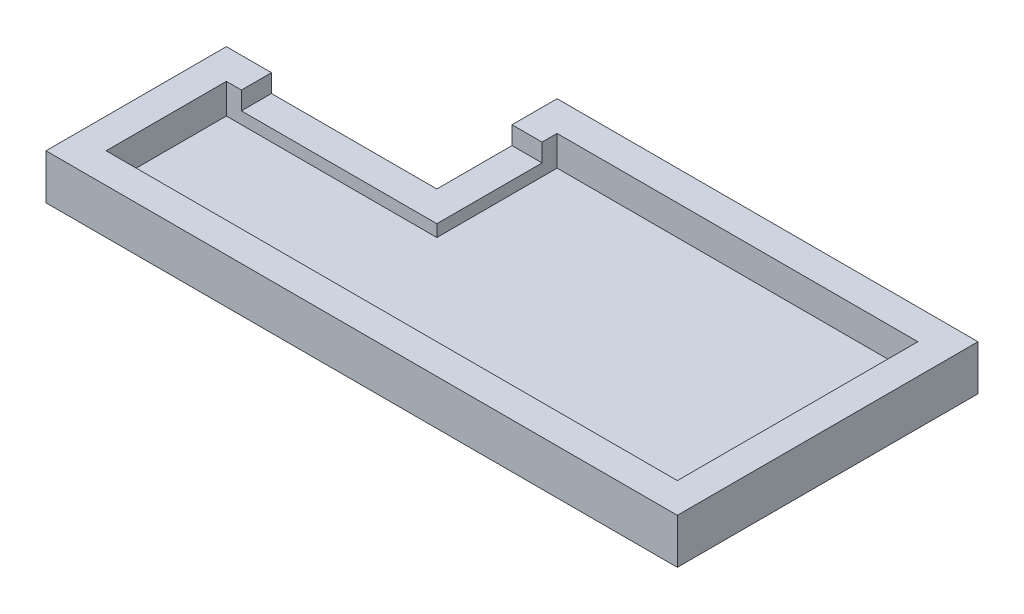
ISO-10303-21;
HEADER;
FILE_DESCRIPTION(('STEP AP214'),'2;1');
FILE_NAME('part.step','',(''),(''),'','','');
FILE_SCHEMA(('AUTOMOTIVE_DESIGN { 1 0 10303 214 1 1 1 1 }'));
ENDSEC;
DATA;
#1=APPLICATION_CONTEXT('core data for automotive mechanical design processes');
#2=APPLICATION_PROTOCOL_DEFINITION('international standard','automotive_design',2000,#1);
#3=PRODUCT_CONTEXT('',#1,'mechanical');
#4=PRODUCT('Part','Part','',(#3));
#5=PRODUCT_RELATED_PRODUCT_CATEGORY('part','',(#4));
#6=PRODUCT_DEFINITION_FORMATION('','',#4);
#7=PRODUCT_DEFINITION_CONTEXT('part definition',#1,'design');
#8=PRODUCT_DEFINITION('design','',#6,#7);
#9=PRODUCT_DEFINITION_SHAPE('','',#8);
#10=(LENGTH_UNIT() NAMED_UNIT(*) SI_UNIT(.MILLI.,.METRE.));
#11=(NAMED_UNIT(*) PLANE_ANGLE_UNIT() SI_UNIT($,.RADIAN.));
#12=(NAMED_UNIT(*) SI_UNIT($,.STERADIAN.) SOLID_ANGLE_UNIT());
#13=UNCERTAINTY_MEASURE_WITH_UNIT(LENGTH_MEASURE(1.E-05),#10,'distance_accuracy_value','');
#14=(GEOMETRIC_REPRESENTATION_CONTEXT(3) GLOBAL_UNCERTAINTY_ASSIGNED_CONTEXT((#13)) GLOBAL_UNIT_ASSIGNED_CONTEXT((#10,
#11,#12)) REPRESENTATION_CONTEXT('',''));
#15=CARTESIAN_POINT('',(0.,0.,0.));
#16=DIRECTION('',(0.,0.,1.));
#17=DIRECTION('',(1.,0.,0.));
#18=AXIS2_PLACEMENT_3D('',#15,#16,#17);
#19=CARTESIAN_POINT('',(266.7,19.05,0.));
#20=DIRECTION('',(0.,0.,-1.));
#21=DIRECTION('',(-1.,0.,0.));
#22=AXIS2_PLACEMENT_3D('',#19,#20,#21);
#23=PLANE('',#22);
#24=DIRECTION('',(1.,0.,0.));
#25=VECTOR('',#24,1.);
#26=CARTESIAN_POINT('',(266.7,0.,0.));
#27=LINE('',#26,#25);
#28=CARTESIAN_POINT('',(0.,0.,0.));
#29=VERTEX_POINT('',#28);
#30=CARTESIAN_POINT('',(266.7,0.,0.));
#31=VERTEX_POINT('',#30);
#32=EDGE_CURVE('E213',#29,#31,#27,.T.);
#33=ORIENTED_EDGE('',*,*,#32,.T.);
#34=DIRECTION('',(0.,-1.,0.));
#35=VECTOR('',#34,1.);
#36=CARTESIAN_POINT('',(266.7,19.05,0.));
#37=LINE('',#36,#35);
#38=CARTESIAN_POINT('',(266.7,19.05,0.));
#39=VERTEX_POINT('',#38);
#40=EDGE_CURVE('E11',#39,#31,#37,.T.);
#41=ORIENTED_EDGE('',*,*,#40,.F.);
#42=DIRECTION('',(1.,0.,0.));
#43=VECTOR('',#42,1.);
#44=CARTESIAN_POINT('',(266.7,19.05,0.));
#45=LINE('',#44,#43);
#46=CARTESIAN_POINT('',(0.,19.05,0.));
#47=VERTEX_POINT('',#46);
#48=EDGE_CURVE('E224',#47,#39,#45,.T.);
#49=ORIENTED_EDGE('',*,*,#48,.F.);
#50=DIRECTION('',(0.,-1.,0.));
#51=VECTOR('',#50,1.);
#52=CARTESIAN_POINT('',(0.,19.05,0.));
#53=LINE('',#52,#51);
#54=EDGE_CURVE('E238',#47,#29,#53,.T.);
#55=ORIENTED_EDGE('',*,*,#54,.T.);
#56=EDGE_LOOP('',(#33,#41,#49,#55));
#57=FACE_BOUND('',#56,.T.);
#58=ADVANCED_FACE('F33',(#57),#23,.F.);
#59=CARTESIAN_POINT('',(266.7,19.05,-127.));
#60=DIRECTION('',(-1.,0.,0.));
#61=DIRECTION('',(0.,0.,1.));
#62=AXIS2_PLACEMENT_3D('',#59,#60,#61);
#63=PLANE('',#62);
#64=DIRECTION('',(0.,0.,-1.));
#65=VECTOR('',#64,1.);
#66=CARTESIAN_POINT('',(266.7,0.,-127.));
#67=LINE('',#66,#65);
#68=CARTESIAN_POINT('',(266.7,0.,-127.));
#69=VERTEX_POINT('',#68);
#70=EDGE_CURVE('E241',#31,#69,#67,.T.);
#71=ORIENTED_EDGE('',*,*,#70,.T.);
#72=DIRECTION('',(0.,-1.,0.));
#73=VECTOR('',#72,1.);
#74=CARTESIAN_POINT('',(266.7,19.05,-127.));
#75=LINE('',#74,#73);
#76=CARTESIAN_POINT('',(266.7,19.05,-127.));
#77=VERTEX_POINT('',#76);
#78=EDGE_CURVE('E40',#77,#69,#75,.T.);
#79=ORIENTED_EDGE('',*,*,#78,.F.);
#80=DIRECTION('',(0.,0.,-1.));
#81=VECTOR('',#80,1.);
#82=CARTESIAN_POINT('',(266.7,19.05,-127.));
#83=LINE('',#82,#81);
#84=EDGE_CURVE('E227',#39,#77,#83,.T.);
#85=ORIENTED_EDGE('',*,*,#84,.F.);
#86=ORIENTED_EDGE('',*,*,#40,.T.);
#87=EDGE_LOOP('',(#71,#79,#85,#86));
#88=FACE_BOUND('',#87,.T.);
#89=ADVANCED_FACE('F284',(#88),#63,.F.);
#90=CARTESIAN_POINT('',(88.9,19.05,-127.));
#91=DIRECTION('',(0.,0.,1.));
#92=DIRECTION('',(1.,0.,0.));
#93=AXIS2_PLACEMENT_3D('',#90,#91,#92);
#94=PLANE('',#93);
#95=DIRECTION('',(-1.,0.,0.));
#96=VECTOR('',#95,1.);
#97=CARTESIAN_POINT('',(88.9,0.,-127.));
#98=LINE('',#97,#96);
#99=CARTESIAN_POINT('',(88.9,0.,-127.));
#100=VERTEX_POINT('',#99);
#101=EDGE_CURVE('E243',#69,#100,#98,.T.);
#102=ORIENTED_EDGE('',*,*,#101,.T.);
#103=DIRECTION('',(0.,-1.,0.));
#104=VECTOR('',#103,1.);
#105=CARTESIAN_POINT('',(88.9,19.05,-127.));
#106=LINE('',#105,#104);
#107=CARTESIAN_POINT('',(88.9,19.05,-127.));
#108=VERTEX_POINT('',#107);
#109=EDGE_CURVE('E258',#108,#100,#106,.T.);
#110=ORIENTED_EDGE('',*,*,#109,.F.);
#111=DIRECTION('',(-1.,0.,0.));
#112=VECTOR('',#111,1.);
#113=CARTESIAN_POINT('',(88.9,19.05,-127.));
#114=LINE('',#113,#112);
#115=EDGE_CURVE('E230',#77,#108,#114,.T.);
#116=ORIENTED_EDGE('',*,*,#115,.F.);
#117=ORIENTED_EDGE('',*,*,#78,.T.);
#118=EDGE_LOOP('',(#102,#110,#116,#117));
#119=FACE_BOUND('',#118,.T.);
#120=ADVANCED_FACE('F265',(#119),#94,.F.);
#121=CARTESIAN_POINT('',(88.9,19.05,-76.2));
#122=DIRECTION('',(1.,0.,0.));
#123=DIRECTION('',(0.,0.,-1.));
#124=AXIS2_PLACEMENT_3D('',#121,#122,#123);
#125=PLANE('',#124);
#126=DIRECTION('',(0.,0.,1.));
#127=VECTOR('',#126,1.);
#128=CARTESIAN_POINT('',(88.9,11.43,-107.95));
#129=LINE('',#128,#127);
#130=CARTESIAN_POINT('',(88.9,11.43,-107.95));
#131=VERTEX_POINT('',#130);
#132=CARTESIAN_POINT('',(88.9,11.43,-76.2));
#133=VERTEX_POINT('',#132);
#134=EDGE_CURVE('E160',#131,#133,#129,.T.);
#135=ORIENTED_EDGE('',*,*,#134,.F.);
#136=DIRECTION('',(0.,1.,0.));
#137=VECTOR('',#136,1.);
#138=CARTESIAN_POINT('',(88.9,11.43,-107.95));
#139=LINE('',#138,#137);
#140=CARTESIAN_POINT('',(88.9,19.05,-107.95));
#141=VERTEX_POINT('',#140);
#142=EDGE_CURVE('E198',#131,#141,#139,.T.);
#143=ORIENTED_EDGE('',*,*,#142,.T.);
#144=DIRECTION('',(0.,0.,1.));
#145=VECTOR('',#144,1.);
#146=CARTESIAN_POINT('',(88.9,19.05,-76.2));
#147=LINE('',#146,#145);
#148=EDGE_CURVE('E232',#108,#141,#147,.T.);
#149=ORIENTED_EDGE('',*,*,#148,.F.);
#150=ORIENTED_EDGE('',*,*,#109,.T.);
#151=DIRECTION('',(0.,0.,1.));
#152=VECTOR('',#151,1.);
#153=CARTESIAN_POINT('',(88.9,0.,-76.2));
#154=LINE('',#153,#152);
#155=CARTESIAN_POINT('',(88.9,0.,-76.2));
#156=VERTEX_POINT('',#155);
#157=EDGE_CURVE('E245',#100,#156,#154,.T.);
#158=ORIENTED_EDGE('',*,*,#157,.T.);
#159=DIRECTION('',(0.,-1.,0.));
#160=VECTOR('',#159,1.);
#161=CARTESIAN_POINT('',(88.9,19.05,-76.2));
#162=LINE('',#161,#160);
#163=EDGE_CURVE('E256',#133,#156,#162,.T.);
#164=ORIENTED_EDGE('',*,*,#163,.F.);
#165=EDGE_LOOP('',(#135,#143,#149,#150,#158,#164));
#166=FACE_BOUND('',#165,.T.);
#167=ADVANCED_FACE('F275',(#166),#125,.F.);
#168=CARTESIAN_POINT('',(0.,19.05,-76.2));
#169=DIRECTION('',(0.,0.,1.));
#170=DIRECTION('',(1.,0.,0.));
#171=AXIS2_PLACEMENT_3D('',#168,#169,#170);
#172=PLANE('',#171);
#173=DIRECTION('',(-1.,0.,0.));
#174=VECTOR('',#173,1.);
#175=CARTESIAN_POINT('',(0.,19.05,-76.2));
#176=LINE('',#175,#174);
#177=CARTESIAN_POINT('',(19.05,19.05,-76.2));
#178=VERTEX_POINT('',#177);
#179=CARTESIAN_POINT('',(0.,19.05,-76.2));
#180=VERTEX_POINT('',#179);
#181=EDGE_CURVE('E168',#178,#180,#176,.T.);
#182=ORIENTED_EDGE('',*,*,#181,.F.);
#183=DIRECTION('',(0.,1.,0.));
#184=VECTOR('',#183,1.);
#185=CARTESIAN_POINT('',(19.05,11.43,-76.2));
#186=LINE('',#185,#184);
#187=CARTESIAN_POINT('',(19.05,11.43,-76.2));
#188=VERTEX_POINT('',#187);
#189=EDGE_CURVE('E150',#188,#178,#186,.T.);
#190=ORIENTED_EDGE('',*,*,#189,.F.);
#191=DIRECTION('',(-1.,0.,0.));
#192=VECTOR('',#191,1.);
#193=CARTESIAN_POINT('',(88.9,11.43,-76.2));
#194=LINE('',#193,#192);
#195=EDGE_CURVE('E154',#133,#188,#194,.T.);
#196=ORIENTED_EDGE('',*,*,#195,.F.);
#197=ORIENTED_EDGE('',*,*,#163,.T.);
#198=DIRECTION('',(-1.,0.,0.));
#199=VECTOR('',#198,1.);
#200=CARTESIAN_POINT('',(0.,0.,-76.2));
#201=LINE('',#200,#199);
#202=CARTESIAN_POINT('',(0.,0.,-76.2));
#203=VERTEX_POINT('',#202);
#204=EDGE_CURVE('E248',#156,#203,#201,.T.);
#205=ORIENTED_EDGE('',*,*,#204,.T.);
#206=DIRECTION('',(0.,-1.,0.));
#207=VECTOR('',#206,1.);
#208=CARTESIAN_POINT('',(0.,19.05,-76.2));
#209=LINE('',#208,#207);
#210=EDGE_CURVE('E253',#180,#203,#209,.T.);
#211=ORIENTED_EDGE('',*,*,#210,.F.);
#212=EDGE_LOOP('',(#182,#190,#196,#197,#205,#211));
#213=FACE_BOUND('',#212,.T.);
#214=ADVANCED_FACE('F166',(#213),#172,.F.);
#215=CARTESIAN_POINT('',(0.,19.05,0.));
#216=DIRECTION('',(1.,0.,0.));
#217=DIRECTION('',(0.,0.,-1.));
#218=AXIS2_PLACEMENT_3D('',#215,#216,#217);
#219=PLANE('',#218);
#220=DIRECTION('',(0.,0.,1.));
#221=VECTOR('',#220,1.);
#222=CARTESIAN_POINT('',(0.,0.,0.));
#223=LINE('',#222,#221);
#224=EDGE_CURVE('E228',#203,#29,#223,.T.);
#225=ORIENTED_EDGE('',*,*,#224,.T.);
#226=ORIENTED_EDGE('',*,*,#54,.F.);
#227=DIRECTION('',(0.,0.,1.));
#228=VECTOR('',#227,1.);
#229=CARTESIAN_POINT('',(0.,19.05,0.));
#230=LINE('',#229,#228);
#231=EDGE_CURVE('E236',#180,#47,#230,.T.);
#232=ORIENTED_EDGE('',*,*,#231,.F.);
#233=ORIENTED_EDGE('',*,*,#210,.T.);
#234=EDGE_LOOP('',(#225,#226,#232,#233));
#235=FACE_BOUND('',#234,.T.);
#236=ADVANCED_FACE('F288',(#235),#219,.F.);
#237=CARTESIAN_POINT('',(0.,19.05,0.));
#238=DIRECTION('',(0.,-1.,0.));
#239=DIRECTION('',(0.,0.,-1.));
#240=AXIS2_PLACEMENT_3D('',#237,#238,#239);
#241=PLANE('',#240);
#242=ORIENTED_EDGE('',*,*,#148,.T.);
#243=DIRECTION('',(-1.,0.,0.));
#244=VECTOR('',#243,1.);
#245=CARTESIAN_POINT('',(101.6,19.05,-107.95));
#246=LINE('',#245,#244);
#247=CARTESIAN_POINT('',(101.6,19.05,-107.95));
#248=VERTEX_POINT('',#247);
#249=EDGE_CURVE('E163',#248,#141,#246,.T.);
#250=ORIENTED_EDGE('',*,*,#249,.F.);
#251=DIRECTION('',(0.,0.,1.));
#252=VECTOR('',#251,1.);
#253=CARTESIAN_POINT('',(101.6,19.05,-63.5));
#254=LINE('',#253,#252);
#255=CARTESIAN_POINT('',(101.6,19.05,-114.3));
#256=VERTEX_POINT('',#255);
#257=EDGE_CURVE('E207',#256,#248,#254,.T.);
#258=ORIENTED_EDGE('',*,*,#257,.F.);
#259=DIRECTION('',(-1.,0.,0.));
#260=VECTOR('',#259,1.);
#261=CARTESIAN_POINT('',(101.6,19.05,-114.3));
#262=LINE('',#261,#260);
#263=CARTESIAN_POINT('',(254.,19.05,-114.3));
#264=VERTEX_POINT('',#263);
#265=EDGE_CURVE('E204',#264,#256,#262,.T.);
#266=ORIENTED_EDGE('',*,*,#265,.F.);
#267=DIRECTION('',(0.,0.,-1.));
#268=VECTOR('',#267,1.);
#269=CARTESIAN_POINT('',(254.,19.05,-114.3));
#270=LINE('',#269,#268);
#271=CARTESIAN_POINT('',(254.,19.05,-12.7));
#272=VERTEX_POINT('',#271);
#273=EDGE_CURVE('E201',#272,#264,#270,.T.);
#274=ORIENTED_EDGE('',*,*,#273,.F.);
#275=DIRECTION('',(1.,0.,0.));
#276=VECTOR('',#275,1.);
#277=CARTESIAN_POINT('',(254.,19.05,-12.7));
#278=LINE('',#277,#276);
#279=CARTESIAN_POINT('',(12.7,19.05,-12.7));
#280=VERTEX_POINT('',#279);
#281=EDGE_CURVE('E197',#280,#272,#278,.T.);
#282=ORIENTED_EDGE('',*,*,#281,.F.);
#283=DIRECTION('',(0.,0.,1.));
#284=VECTOR('',#283,1.);
#285=CARTESIAN_POINT('',(12.7,19.05,-12.7));
#286=LINE('',#285,#284);
#287=CARTESIAN_POINT('',(12.7,19.05,-63.5));
#288=VERTEX_POINT('',#287);
#289=EDGE_CURVE('E55',#288,#280,#286,.T.);
#290=ORIENTED_EDGE('',*,*,#289,.F.);
#291=DIRECTION('',(-1.,0.,0.));
#292=VECTOR('',#291,1.);
#293=CARTESIAN_POINT('',(12.7,19.05,-63.5));
#294=LINE('',#293,#292);
#295=CARTESIAN_POINT('',(19.05,19.05,-63.5));
#296=VERTEX_POINT('',#295);
#297=EDGE_CURVE('E180',#296,#288,#294,.T.);
#298=ORIENTED_EDGE('',*,*,#297,.F.);
#299=DIRECTION('',(0.,0.,1.));
#300=VECTOR('',#299,1.);
#301=CARTESIAN_POINT('',(19.05,19.05,-76.2));
#302=LINE('',#301,#300);
#303=EDGE_CURVE('E291',#178,#296,#302,.T.);
#304=ORIENTED_EDGE('',*,*,#303,.F.);
#305=ORIENTED_EDGE('',*,*,#181,.T.);
#306=ORIENTED_EDGE('',*,*,#231,.T.);
#307=ORIENTED_EDGE('',*,*,#48,.T.);
#308=ORIENTED_EDGE('',*,*,#84,.T.);
#309=ORIENTED_EDGE('',*,*,#115,.T.);
#310=EDGE_LOOP('',(#242,#250,#258,#266,#274,#282,#290,#298,#304,#305,#306,#307,#308,#309));
#311=FACE_BOUND('',#310,.T.);
#312=ADVANCED_FACE('F280',(#311),#241,.F.);
#313=CARTESIAN_POINT('',(0.,0.,0.));
#314=DIRECTION('',(0.,-1.,0.));
#315=DIRECTION('',(0.,0.,-1.));
#316=AXIS2_PLACEMENT_3D('',#313,#314,#315);
#317=PLANE('',#316);
#318=ORIENTED_EDGE('',*,*,#32,.F.);
#319=ORIENTED_EDGE('',*,*,#224,.F.);
#320=ORIENTED_EDGE('',*,*,#204,.F.);
#321=ORIENTED_EDGE('',*,*,#157,.F.);
#322=ORIENTED_EDGE('',*,*,#101,.F.);
#323=ORIENTED_EDGE('',*,*,#70,.F.);
#324=EDGE_LOOP('',(#318,#319,#320,#321,#322,#323));
#325=FACE_BOUND('',#324,.T.);
#326=ADVANCED_FACE('F271',(#325),#317,.T.);
#327=CARTESIAN_POINT('',(12.7,6.35,-12.7));
#328=DIRECTION('',(-1.,0.,0.));
#329=DIRECTION('',(0.,0.,1.));
#330=AXIS2_PLACEMENT_3D('',#327,#328,#329);
#331=PLANE('',#330);
#332=ORIENTED_EDGE('',*,*,#289,.T.);
#333=DIRECTION('',(0.,1.,0.));
#334=VECTOR('',#333,1.);
#335=CARTESIAN_POINT('',(12.7,6.35,-12.7));
#336=LINE('',#335,#334);
#337=CARTESIAN_POINT('',(12.7,6.35,-12.7));
#338=VERTEX_POINT('',#337);
#339=EDGE_CURVE('E195',#338,#280,#336,.T.);
#340=ORIENTED_EDGE('',*,*,#339,.F.);
#341=DIRECTION('',(0.,0.,1.));
#342=VECTOR('',#341,1.);
#343=CARTESIAN_POINT('',(12.7,6.35,-12.7));
#344=LINE('',#343,#342);
#345=CARTESIAN_POINT('',(12.7,6.35,-63.5));
#346=VERTEX_POINT('',#345);
#347=EDGE_CURVE('E176',#346,#338,#344,.T.);
#348=ORIENTED_EDGE('',*,*,#347,.F.);
#349=DIRECTION('',(0.,1.,0.));
#350=VECTOR('',#349,1.);
#351=CARTESIAN_POINT('',(12.7,6.35,-63.5));
#352=LINE('',#351,#350);
#353=EDGE_CURVE('E211',#346,#288,#352,.T.);
#354=ORIENTED_EDGE('',*,*,#353,.T.);
#355=EDGE_LOOP('',(#332,#340,#348,#354));
#356=FACE_BOUND('',#355,.T.);
#357=ADVANCED_FACE('F316',(#356),#331,.F.);
#358=CARTESIAN_POINT('',(12.7,6.35,-63.5));
#359=DIRECTION('',(0.,0.,-1.));
#360=DIRECTION('',(-1.,0.,0.));
#361=AXIS2_PLACEMENT_3D('',#358,#359,#360);
#362=PLANE('',#361);
#363=DIRECTION('',(1.,0.,0.));
#364=VECTOR('',#363,1.);
#365=CARTESIAN_POINT('',(19.05,11.43,-63.5));
#366=LINE('',#365,#364);
#367=CARTESIAN_POINT('',(19.05,11.43,-63.5));
#368=VERTEX_POINT('',#367);
#369=CARTESIAN_POINT('',(101.6,11.43,-63.5));
#370=VERTEX_POINT('',#369);
#371=EDGE_CURVE('E47',#368,#370,#366,.T.);
#372=ORIENTED_EDGE('',*,*,#371,.F.);
#373=DIRECTION('',(0.,1.,0.));
#374=VECTOR('',#373,1.);
#375=CARTESIAN_POINT('',(19.05,11.43,-63.5));
#376=LINE('',#375,#374);
#377=EDGE_CURVE('E153',#368,#296,#376,.T.);
#378=ORIENTED_EDGE('',*,*,#377,.T.);
#379=ORIENTED_EDGE('',*,*,#297,.T.);
#380=ORIENTED_EDGE('',*,*,#353,.F.);
#381=DIRECTION('',(-1.,0.,0.));
#382=VECTOR('',#381,1.);
#383=CARTESIAN_POINT('',(12.7,6.35,-63.5));
#384=LINE('',#383,#382);
#385=CARTESIAN_POINT('',(101.6,6.35,-63.5));
#386=VERTEX_POINT('',#385);
#387=EDGE_CURVE('E192',#386,#346,#384,.T.);
#388=ORIENTED_EDGE('',*,*,#387,.F.);
#389=DIRECTION('',(0.,1.,0.));
#390=VECTOR('',#389,1.);
#391=CARTESIAN_POINT('',(101.6,6.35,-63.5));
#392=LINE('',#391,#390);
#393=EDGE_CURVE('E214',#386,#370,#392,.T.);
#394=ORIENTED_EDGE('',*,*,#393,.T.);
#395=EDGE_LOOP('',(#372,#378,#379,#380,#388,#394));
#396=FACE_BOUND('',#395,.T.);
#397=ADVANCED_FACE('F321',(#396),#362,.F.);
#398=CARTESIAN_POINT('',(101.6,6.35,-63.5));
#399=DIRECTION('',(-1.,0.,0.));
#400=DIRECTION('',(0.,0.,1.));
#401=AXIS2_PLACEMENT_3D('',#398,#399,#400);
#402=PLANE('',#401);
#403=ORIENTED_EDGE('',*,*,#257,.T.);
#404=DIRECTION('',(0.,1.,0.));
#405=VECTOR('',#404,1.);
#406=CARTESIAN_POINT('',(101.6,11.43,-107.95));
#407=LINE('',#406,#405);
#408=CARTESIAN_POINT('',(101.6,11.43,-107.95));
#409=VERTEX_POINT('',#408);
#410=EDGE_CURVE('E170',#409,#248,#407,.T.);
#411=ORIENTED_EDGE('',*,*,#410,.F.);
#412=DIRECTION('',(0.,0.,-1.));
#413=VECTOR('',#412,1.);
#414=CARTESIAN_POINT('',(101.6,11.43,-63.5));
#415=LINE('',#414,#413);
#416=EDGE_CURVE('E301',#370,#409,#415,.T.);
#417=ORIENTED_EDGE('',*,*,#416,.F.);
#418=ORIENTED_EDGE('',*,*,#393,.F.);
#419=DIRECTION('',(0.,0.,1.));
#420=VECTOR('',#419,1.);
#421=CARTESIAN_POINT('',(101.6,6.35,-63.5));
#422=LINE('',#421,#420);
#423=CARTESIAN_POINT('',(101.6,6.35,-114.3));
#424=VERTEX_POINT('',#423);
#425=EDGE_CURVE('E189',#424,#386,#422,.T.);
#426=ORIENTED_EDGE('',*,*,#425,.F.);
#427=DIRECTION('',(0.,1.,0.));
#428=VECTOR('',#427,1.);
#429=CARTESIAN_POINT('',(101.6,6.35,-114.3));
#430=LINE('',#429,#428);
#431=EDGE_CURVE('E217',#424,#256,#430,.T.);
#432=ORIENTED_EDGE('',*,*,#431,.T.);
#433=EDGE_LOOP('',(#403,#411,#417,#418,#426,#432));
#434=FACE_BOUND('',#433,.T.);
#435=ADVANCED_FACE('F300',(#434),#402,.F.);
#436=CARTESIAN_POINT('',(101.6,6.35,-114.3));
#437=DIRECTION('',(0.,0.,-1.));
#438=DIRECTION('',(-1.,0.,0.));
#439=AXIS2_PLACEMENT_3D('',#436,#437,#438);
#440=PLANE('',#439);
#441=ORIENTED_EDGE('',*,*,#265,.T.);
#442=ORIENTED_EDGE('',*,*,#431,.F.);
#443=DIRECTION('',(-1.,0.,0.));
#444=VECTOR('',#443,1.);
#445=CARTESIAN_POINT('',(101.6,6.35,-114.3));
#446=LINE('',#445,#444);
#447=CARTESIAN_POINT('',(254.,6.35,-114.3));
#448=VERTEX_POINT('',#447);
#449=EDGE_CURVE('E186',#448,#424,#446,.T.);
#450=ORIENTED_EDGE('',*,*,#449,.F.);
#451=DIRECTION('',(0.,1.,0.));
#452=VECTOR('',#451,1.);
#453=CARTESIAN_POINT('',(254.,6.35,-114.3));
#454=LINE('',#453,#452);
#455=EDGE_CURVE('E219',#448,#264,#454,.T.);
#456=ORIENTED_EDGE('',*,*,#455,.T.);
#457=EDGE_LOOP('',(#441,#442,#450,#456));
#458=FACE_BOUND('',#457,.T.);
#459=ADVANCED_FACE('F307',(#458),#440,.F.);
#460=CARTESIAN_POINT('',(254.,6.35,-114.3));
#461=DIRECTION('',(1.,0.,0.));
#462=DIRECTION('',(0.,0.,-1.));
#463=AXIS2_PLACEMENT_3D('',#460,#461,#462);
#464=PLANE('',#463);
#465=ORIENTED_EDGE('',*,*,#273,.T.);
#466=ORIENTED_EDGE('',*,*,#455,.F.);
#467=DIRECTION('',(0.,0.,-1.));
#468=VECTOR('',#467,1.);
#469=CARTESIAN_POINT('',(254.,6.35,-114.3));
#470=LINE('',#469,#468);
#471=CARTESIAN_POINT('',(254.,6.35,-12.7));
#472=VERTEX_POINT('',#471);
#473=EDGE_CURVE('E183',#472,#448,#470,.T.);
#474=ORIENTED_EDGE('',*,*,#473,.F.);
#475=DIRECTION('',(0.,1.,0.));
#476=VECTOR('',#475,1.);
#477=CARTESIAN_POINT('',(254.,6.35,-12.7));
#478=LINE('',#477,#476);
#479=EDGE_CURVE('E221',#472,#272,#478,.T.);
#480=ORIENTED_EDGE('',*,*,#479,.T.);
#481=EDGE_LOOP('',(#465,#466,#474,#480));
#482=FACE_BOUND('',#481,.T.);
#483=ADVANCED_FACE('F311',(#482),#464,.F.);
#484=CARTESIAN_POINT('',(254.,6.35,-12.7));
#485=DIRECTION('',(0.,0.,1.));
#486=DIRECTION('',(1.,0.,0.));
#487=AXIS2_PLACEMENT_3D('',#484,#485,#486);
#488=PLANE('',#487);
#489=ORIENTED_EDGE('',*,*,#281,.T.);
#490=ORIENTED_EDGE('',*,*,#479,.F.);
#491=DIRECTION('',(1.,0.,0.));
#492=VECTOR('',#491,1.);
#493=CARTESIAN_POINT('',(254.,6.35,-12.7));
#494=LINE('',#493,#492);
#495=EDGE_CURVE('E179',#338,#472,#494,.T.);
#496=ORIENTED_EDGE('',*,*,#495,.F.);
#497=ORIENTED_EDGE('',*,*,#339,.T.);
#498=EDGE_LOOP('',(#489,#490,#496,#497));
#499=FACE_BOUND('',#498,.T.);
#500=ADVANCED_FACE('F314',(#499),#488,.F.);
#501=CARTESIAN_POINT('',(0.,6.35,0.));
#502=DIRECTION('',(0.,-1.,0.));
#503=DIRECTION('',(0.,0.,-1.));
#504=AXIS2_PLACEMENT_3D('',#501,#502,#503);
#505=PLANE('',#504);
#506=ORIENTED_EDGE('',*,*,#347,.T.);
#507=ORIENTED_EDGE('',*,*,#495,.T.);
#508=ORIENTED_EDGE('',*,*,#473,.T.);
#509=ORIENTED_EDGE('',*,*,#449,.T.);
#510=ORIENTED_EDGE('',*,*,#425,.T.);
#511=ORIENTED_EDGE('',*,*,#387,.T.);
#512=EDGE_LOOP('',(#506,#507,#508,#509,#510,#511));
#513=FACE_BOUND('',#512,.T.);
#514=ADVANCED_FACE('F319',(#513),#505,.F.);
#515=CARTESIAN_POINT('',(101.6,11.43,-107.95));
#516=DIRECTION('',(0.,0.,-1.));
#517=DIRECTION('',(-1.,0.,0.));
#518=AXIS2_PLACEMENT_3D('',#515,#516,#517);
#519=PLANE('',#518);
#520=ORIENTED_EDGE('',*,*,#249,.T.);
#521=ORIENTED_EDGE('',*,*,#142,.F.);
#522=DIRECTION('',(-1.,0.,0.));
#523=VECTOR('',#522,1.);
#524=CARTESIAN_POINT('',(101.6,11.43,-107.95));
#525=LINE('',#524,#523);
#526=EDGE_CURVE('E172',#409,#131,#525,.T.);
#527=ORIENTED_EDGE('',*,*,#526,.F.);
#528=ORIENTED_EDGE('',*,*,#410,.T.);
#529=EDGE_LOOP('',(#520,#521,#527,#528));
#530=FACE_BOUND('',#529,.T.);
#531=ADVANCED_FACE('F298',(#530),#519,.F.);
#532=CARTESIAN_POINT('',(19.05,11.43,-76.2));
#533=DIRECTION('',(-1.,0.,0.));
#534=DIRECTION('',(0.,0.,1.));
#535=AXIS2_PLACEMENT_3D('',#532,#533,#534);
#536=PLANE('',#535);
#537=ORIENTED_EDGE('',*,*,#303,.T.);
#538=ORIENTED_EDGE('',*,*,#377,.F.);
#539=DIRECTION('',(0.,0.,1.));
#540=VECTOR('',#539,1.);
#541=CARTESIAN_POINT('',(19.05,11.43,-76.2));
#542=LINE('',#541,#540);
#543=EDGE_CURVE('E146',#188,#368,#542,.T.);
#544=ORIENTED_EDGE('',*,*,#543,.F.);
#545=ORIENTED_EDGE('',*,*,#189,.T.);
#546=EDGE_LOOP('',(#537,#538,#544,#545));
#547=FACE_BOUND('',#546,.T.);
#548=ADVANCED_FACE('F148',(#547),#536,.F.);
#549=CARTESIAN_POINT('',(0.,11.43,0.));
#550=DIRECTION('',(0.,1.,0.));
#551=DIRECTION('',(0.,0.,1.));
#552=AXIS2_PLACEMENT_3D('',#549,#550,#551);
#553=PLANE('',#552);
#554=ORIENTED_EDGE('',*,*,#195,.T.);
#555=ORIENTED_EDGE('',*,*,#543,.T.);
#556=ORIENTED_EDGE('',*,*,#371,.T.);
#557=ORIENTED_EDGE('',*,*,#416,.T.);
#558=ORIENTED_EDGE('',*,*,#526,.T.);
#559=ORIENTED_EDGE('',*,*,#134,.T.);
#560=EDGE_LOOP('',(#554,#555,#556,#557,#558,#559));
#561=FACE_BOUND('',#560,.T.);
#562=ADVANCED_FACE('F157',(#561),#553,.T.);
#563=CLOSED_SHELL('',(#58,#89,#120,#167,#214,#236,#312,#326,#357,#397,#435,#459,#483,#500,#514,
#531,#548,#562));
#564=MANIFOLD_SOLID_BREP('B2',#563);
#565=ADVANCED_BREP_SHAPE_REPRESENTATION('',(#18,#564),#14);
#566=SHAPE_DEFINITION_REPRESENTATION(#9,#565);
ENDSEC;
END-ISO-10303-21;
